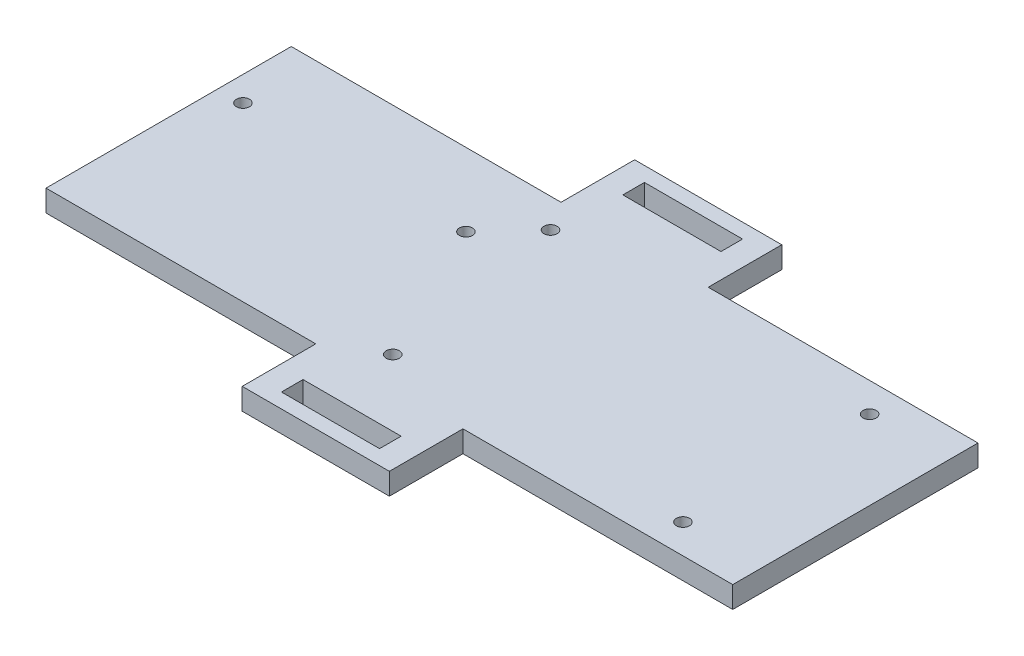
ISO-10303-21;
HEADER;
FILE_DESCRIPTION(('STEP AP214'),'2;1');
FILE_NAME('part.step','',(''),(''),'','','');
FILE_SCHEMA(('AUTOMOTIVE_DESIGN { 1 0 10303 214 1 1 1 1 }'));
ENDSEC;
DATA;
#1=APPLICATION_CONTEXT('core data for automotive mechanical design processes');
#2=APPLICATION_PROTOCOL_DEFINITION('international standard','automotive_design',2000,#1);
#3=PRODUCT_CONTEXT('',#1,'mechanical');
#4=PRODUCT('Part','Part','',(#3));
#5=PRODUCT_RELATED_PRODUCT_CATEGORY('part','',(#4));
#6=PRODUCT_DEFINITION_FORMATION('','',#4);
#7=PRODUCT_DEFINITION_CONTEXT('part definition',#1,'design');
#8=PRODUCT_DEFINITION('design','',#6,#7);
#9=PRODUCT_DEFINITION_SHAPE('','',#8);
#10=(LENGTH_UNIT() NAMED_UNIT(*) SI_UNIT(.MILLI.,.METRE.));
#11=(NAMED_UNIT(*) PLANE_ANGLE_UNIT() SI_UNIT($,.RADIAN.));
#12=(NAMED_UNIT(*) SI_UNIT($,.STERADIAN.) SOLID_ANGLE_UNIT());
#13=UNCERTAINTY_MEASURE_WITH_UNIT(LENGTH_MEASURE(1.E-05),#10,'distance_accuracy_value','');
#14=(GEOMETRIC_REPRESENTATION_CONTEXT(3) GLOBAL_UNCERTAINTY_ASSIGNED_CONTEXT((#13)) GLOBAL_UNIT_ASSIGNED_CONTEXT((#10,
#11,#12)) REPRESENTATION_CONTEXT('',''));
#15=CARTESIAN_POINT('',(0.,0.,0.));
#16=DIRECTION('',(0.,0.,1.));
#17=DIRECTION('',(1.,0.,0.));
#18=AXIS2_PLACEMENT_3D('',#15,#16,#17);
#19=CARTESIAN_POINT('',(19.05,5.588,-31.75));
#20=DIRECTION('',(0.,0.,1.));
#21=DIRECTION('',(1.,0.,0.));
#22=AXIS2_PLACEMENT_3D('',#19,#20,#21);
#23=PLANE('',#22);
#24=DIRECTION('',(-1.,0.,0.));
#25=VECTOR('',#24,1.);
#26=CARTESIAN_POINT('',(19.05,0.,-31.75));
#27=LINE('',#26,#25);
#28=CARTESIAN_POINT('',(88.9,0.,-31.75));
#29=VERTEX_POINT('',#28);
#30=CARTESIAN_POINT('',(19.05,0.,-31.75));
#31=VERTEX_POINT('',#30);
#32=EDGE_CURVE('E210',#29,#31,#27,.T.);
#33=ORIENTED_EDGE('',*,*,#32,.T.);
#34=DIRECTION('',(0.,-1.,0.));
#35=VECTOR('',#34,1.);
#36=CARTESIAN_POINT('',(19.05,5.588,-31.75));
#37=LINE('',#36,#35);
#38=CARTESIAN_POINT('',(19.05,5.588,-31.75));
#39=VERTEX_POINT('',#38);
#40=EDGE_CURVE('E11',#39,#31,#37,.T.);
#41=ORIENTED_EDGE('',*,*,#40,.F.);
#42=DIRECTION('',(-1.,0.,0.));
#43=VECTOR('',#42,1.);
#44=CARTESIAN_POINT('',(19.05,5.588,-31.75));
#45=LINE('',#44,#43);
#46=CARTESIAN_POINT('',(88.9,5.588,-31.75));
#47=VERTEX_POINT('',#46);
#48=EDGE_CURVE('E243',#47,#39,#45,.T.);
#49=ORIENTED_EDGE('',*,*,#48,.F.);
#50=DIRECTION('',(0.,-1.,0.));
#51=VECTOR('',#50,1.);
#52=CARTESIAN_POINT('',(88.9,5.588,-31.75));
#53=LINE('',#52,#51);
#54=EDGE_CURVE('E269',#47,#29,#53,.T.);
#55=ORIENTED_EDGE('',*,*,#54,.T.);
#56=EDGE_LOOP('',(#33,#41,#49,#55));
#57=FACE_BOUND('',#56,.T.);
#58=ADVANCED_FACE('F34',(#57),#23,.F.);
#59=CARTESIAN_POINT('',(19.05,5.588,-31.75));
#60=DIRECTION('',(-1.,0.,0.));
#61=DIRECTION('',(0.,0.,1.));
#62=AXIS2_PLACEMENT_3D('',#59,#60,#61);
#63=PLANE('',#62);
#64=DIRECTION('',(0.,0.,-1.));
#65=VECTOR('',#64,1.);
#66=CARTESIAN_POINT('',(19.05,0.,-31.75));
#67=LINE('',#66,#65);
#68=CARTESIAN_POINT('',(19.05,0.,-50.8));
#69=VERTEX_POINT('',#68);
#70=EDGE_CURVE('E272',#31,#69,#67,.T.);
#71=ORIENTED_EDGE('',*,*,#70,.T.);
#72=DIRECTION('',(0.,-1.,0.));
#73=VECTOR('',#72,1.);
#74=CARTESIAN_POINT('',(19.05,5.588,-50.8));
#75=LINE('',#74,#73);
#76=CARTESIAN_POINT('',(19.05,5.588,-50.8));
#77=VERTEX_POINT('',#76);
#78=EDGE_CURVE('E41',#77,#69,#75,.T.);
#79=ORIENTED_EDGE('',*,*,#78,.F.);
#80=DIRECTION('',(0.,0.,-1.));
#81=VECTOR('',#80,1.);
#82=CARTESIAN_POINT('',(19.05,5.588,-31.75));
#83=LINE('',#82,#81);
#84=EDGE_CURVE('E246',#39,#77,#83,.T.);
#85=ORIENTED_EDGE('',*,*,#84,.F.);
#86=ORIENTED_EDGE('',*,*,#40,.T.);
#87=EDGE_LOOP('',(#71,#79,#85,#86));
#88=FACE_BOUND('',#87,.T.);
#89=ADVANCED_FACE('F348',(#88),#63,.F.);
#90=CARTESIAN_POINT('',(19.05,5.588,-50.8));
#91=DIRECTION('',(0.,0.,1.));
#92=DIRECTION('',(1.,0.,0.));
#93=AXIS2_PLACEMENT_3D('',#90,#91,#92);
#94=PLANE('',#93);
#95=DIRECTION('',(-1.,0.,0.));
#96=VECTOR('',#95,1.);
#97=CARTESIAN_POINT('',(19.05,0.,-50.8));
#98=LINE('',#97,#96);
#99=CARTESIAN_POINT('',(-19.05,0.,-50.8));
#100=VERTEX_POINT('',#99);
#101=EDGE_CURVE('E274',#69,#100,#98,.T.);
#102=ORIENTED_EDGE('',*,*,#101,.T.);
#103=DIRECTION('',(0.,-1.,0.));
#104=VECTOR('',#103,1.);
#105=CARTESIAN_POINT('',(-19.05,5.588,-50.8));
#106=LINE('',#105,#104);
#107=CARTESIAN_POINT('',(-19.05,5.588,-50.8));
#108=VERTEX_POINT('',#107);
#109=EDGE_CURVE('E319',#108,#100,#106,.T.);
#110=ORIENTED_EDGE('',*,*,#109,.F.);
#111=DIRECTION('',(-1.,0.,0.));
#112=VECTOR('',#111,1.);
#113=CARTESIAN_POINT('',(19.05,5.588,-50.8));
#114=LINE('',#113,#112);
#115=EDGE_CURVE('E249',#77,#108,#114,.T.);
#116=ORIENTED_EDGE('',*,*,#115,.F.);
#117=ORIENTED_EDGE('',*,*,#78,.T.);
#118=EDGE_LOOP('',(#102,#110,#116,#117));
#119=FACE_BOUND('',#118,.T.);
#120=ADVANCED_FACE('F326',(#119),#94,.F.);
#121=CARTESIAN_POINT('',(-19.05,5.588,-50.8));
#122=DIRECTION('',(1.,0.,0.));
#123=DIRECTION('',(0.,0.,-1.));
#124=AXIS2_PLACEMENT_3D('',#121,#122,#123);
#125=PLANE('',#124);
#126=DIRECTION('',(0.,0.,1.));
#127=VECTOR('',#126,1.);
#128=CARTESIAN_POINT('',(-19.05,0.,-50.8));
#129=LINE('',#128,#127);
#130=CARTESIAN_POINT('',(-19.05,0.,-31.75));
#131=VERTEX_POINT('',#130);
#132=EDGE_CURVE('E276',#100,#131,#129,.T.);
#133=ORIENTED_EDGE('',*,*,#132,.T.);
#134=DIRECTION('',(0.,-1.,0.));
#135=VECTOR('',#134,1.);
#136=CARTESIAN_POINT('',(-19.05,5.588,-31.75));
#137=LINE('',#136,#135);
#138=CARTESIAN_POINT('',(-19.05,5.588,-31.75));
#139=VERTEX_POINT('',#138);
#140=EDGE_CURVE('E316',#139,#131,#137,.T.);
#141=ORIENTED_EDGE('',*,*,#140,.F.);
#142=DIRECTION('',(0.,0.,1.));
#143=VECTOR('',#142,1.);
#144=CARTESIAN_POINT('',(-19.05,5.588,-50.8));
#145=LINE('',#144,#143);
#146=EDGE_CURVE('E251',#108,#139,#145,.T.);
#147=ORIENTED_EDGE('',*,*,#146,.F.);
#148=ORIENTED_EDGE('',*,*,#109,.T.);
#149=EDGE_LOOP('',(#133,#141,#147,#148));
#150=FACE_BOUND('',#149,.T.);
#151=ADVANCED_FACE('F336',(#150),#125,.F.);
#152=CARTESIAN_POINT('',(-88.9,5.588,-31.75));
#153=DIRECTION('',(0.,0.,1.));
#154=DIRECTION('',(1.,0.,0.));
#155=AXIS2_PLACEMENT_3D('',#152,#153,#154);
#156=PLANE('',#155);
#157=DIRECTION('',(-1.,0.,0.));
#158=VECTOR('',#157,1.);
#159=CARTESIAN_POINT('',(-88.9,0.,-31.75));
#160=LINE('',#159,#158);
#161=CARTESIAN_POINT('',(-88.9,0.,-31.75));
#162=VERTEX_POINT('',#161);
#163=EDGE_CURVE('E278',#131,#162,#160,.T.);
#164=ORIENTED_EDGE('',*,*,#163,.T.);
#165=DIRECTION('',(0.,-1.,0.));
#166=VECTOR('',#165,1.);
#167=CARTESIAN_POINT('',(-88.9,5.588,-31.75));
#168=LINE('',#167,#166);
#169=CARTESIAN_POINT('',(-88.9,5.588,-31.75));
#170=VERTEX_POINT('',#169);
#171=EDGE_CURVE('E313',#170,#162,#168,.T.);
#172=ORIENTED_EDGE('',*,*,#171,.F.);
#173=DIRECTION('',(-1.,0.,0.));
#174=VECTOR('',#173,1.);
#175=CARTESIAN_POINT('',(-88.9,5.588,-31.75));
#176=LINE('',#175,#174);
#177=EDGE_CURVE('E253',#139,#170,#176,.T.);
#178=ORIENTED_EDGE('',*,*,#177,.F.);
#179=ORIENTED_EDGE('',*,*,#140,.T.);
#180=EDGE_LOOP('',(#164,#172,#178,#179));
#181=FACE_BOUND('',#180,.T.);
#182=ADVANCED_FACE('F340',(#181),#156,.F.);
#183=CARTESIAN_POINT('',(-88.9,5.588,31.75));
#184=DIRECTION('',(1.,0.,0.));
#185=DIRECTION('',(0.,0.,-1.));
#186=AXIS2_PLACEMENT_3D('',#183,#184,#185);
#187=PLANE('',#186);
#188=DIRECTION('',(0.,0.,1.));
#189=VECTOR('',#188,1.);
#190=CARTESIAN_POINT('',(-88.9,0.,31.75));
#191=LINE('',#190,#189);
#192=CARTESIAN_POINT('',(-88.9,0.,31.75));
#193=VERTEX_POINT('',#192);
#194=EDGE_CURVE('E280',#162,#193,#191,.T.);
#195=ORIENTED_EDGE('',*,*,#194,.T.);
#196=DIRECTION('',(0.,-1.,0.));
#197=VECTOR('',#196,1.);
#198=CARTESIAN_POINT('',(-88.9,5.588,31.75));
#199=LINE('',#198,#197);
#200=CARTESIAN_POINT('',(-88.9,5.588,31.75));
#201=VERTEX_POINT('',#200);
#202=EDGE_CURVE('E310',#201,#193,#199,.T.);
#203=ORIENTED_EDGE('',*,*,#202,.F.);
#204=DIRECTION('',(0.,0.,1.));
#205=VECTOR('',#204,1.);
#206=CARTESIAN_POINT('',(-88.9,5.588,31.75));
#207=LINE('',#206,#205);
#208=EDGE_CURVE('E255',#170,#201,#207,.T.);
#209=ORIENTED_EDGE('',*,*,#208,.F.);
#210=ORIENTED_EDGE('',*,*,#171,.T.);
#211=EDGE_LOOP('',(#195,#203,#209,#210));
#212=FACE_BOUND('',#211,.T.);
#213=ADVANCED_FACE('F381',(#212),#187,.F.);
#214=CARTESIAN_POINT('',(-88.9,5.588,31.75));
#215=DIRECTION('',(0.,0.,-1.));
#216=DIRECTION('',(-1.,0.,0.));
#217=AXIS2_PLACEMENT_3D('',#214,#215,#216);
#218=PLANE('',#217);
#219=DIRECTION('',(1.,0.,0.));
#220=VECTOR('',#219,1.);
#221=CARTESIAN_POINT('',(-88.9,0.,31.75));
#222=LINE('',#221,#220);
#223=CARTESIAN_POINT('',(-19.05,0.,31.75));
#224=VERTEX_POINT('',#223);
#225=EDGE_CURVE('E282',#193,#224,#222,.T.);
#226=ORIENTED_EDGE('',*,*,#225,.T.);
#227=DIRECTION('',(0.,-1.,0.));
#228=VECTOR('',#227,1.);
#229=CARTESIAN_POINT('',(-19.05,5.588,31.75));
#230=LINE('',#229,#228);
#231=CARTESIAN_POINT('',(-19.05,5.588,31.75));
#232=VERTEX_POINT('',#231);
#233=EDGE_CURVE('E307',#232,#224,#230,.T.);
#234=ORIENTED_EDGE('',*,*,#233,.F.);
#235=DIRECTION('',(1.,0.,0.));
#236=VECTOR('',#235,1.);
#237=CARTESIAN_POINT('',(-88.9,5.588,31.75));
#238=LINE('',#237,#236);
#239=EDGE_CURVE('E257',#201,#232,#238,.T.);
#240=ORIENTED_EDGE('',*,*,#239,.F.);
#241=ORIENTED_EDGE('',*,*,#202,.T.);
#242=EDGE_LOOP('',(#226,#234,#240,#241));
#243=FACE_BOUND('',#242,.T.);
#244=ADVANCED_FACE('F379',(#243),#218,.F.);
#245=CARTESIAN_POINT('',(-19.05,5.588,50.8));
#246=DIRECTION('',(1.,0.,0.));
#247=DIRECTION('',(0.,0.,-1.));
#248=AXIS2_PLACEMENT_3D('',#245,#246,#247);
#249=PLANE('',#248);
#250=DIRECTION('',(0.,0.,1.));
#251=VECTOR('',#250,1.);
#252=CARTESIAN_POINT('',(-19.05,0.,50.8));
#253=LINE('',#252,#251);
#254=CARTESIAN_POINT('',(-19.05,0.,50.8));
#255=VERTEX_POINT('',#254);
#256=EDGE_CURVE('E284',#224,#255,#253,.T.);
#257=ORIENTED_EDGE('',*,*,#256,.T.);
#258=DIRECTION('',(0.,-1.,0.));
#259=VECTOR('',#258,1.);
#260=CARTESIAN_POINT('',(-19.05,5.588,50.8));
#261=LINE('',#260,#259);
#262=CARTESIAN_POINT('',(-19.05,5.588,50.8));
#263=VERTEX_POINT('',#262);
#264=EDGE_CURVE('E304',#263,#255,#261,.T.);
#265=ORIENTED_EDGE('',*,*,#264,.F.);
#266=DIRECTION('',(0.,0.,1.));
#267=VECTOR('',#266,1.);
#268=CARTESIAN_POINT('',(-19.05,5.588,50.8));
#269=LINE('',#268,#267);
#270=EDGE_CURVE('E259',#232,#263,#269,.T.);
#271=ORIENTED_EDGE('',*,*,#270,.F.);
#272=ORIENTED_EDGE('',*,*,#233,.T.);
#273=EDGE_LOOP('',(#257,#265,#271,#272));
#274=FACE_BOUND('',#273,.T.);
#275=ADVANCED_FACE('F375',(#274),#249,.F.);
#276=CARTESIAN_POINT('',(19.05,5.588,50.8));
#277=DIRECTION('',(0.,0.,-1.));
#278=DIRECTION('',(-1.,0.,0.));
#279=AXIS2_PLACEMENT_3D('',#276,#277,#278);
#280=PLANE('',#279);
#281=DIRECTION('',(1.,0.,0.));
#282=VECTOR('',#281,1.);
#283=CARTESIAN_POINT('',(19.05,0.,50.8));
#284=LINE('',#283,#282);
#285=CARTESIAN_POINT('',(19.05,0.,50.8));
#286=VERTEX_POINT('',#285);
#287=EDGE_CURVE('E286',#255,#286,#284,.T.);
#288=ORIENTED_EDGE('',*,*,#287,.T.);
#289=DIRECTION('',(0.,-1.,0.));
#290=VECTOR('',#289,1.);
#291=CARTESIAN_POINT('',(19.05,5.588,50.8));
#292=LINE('',#291,#290);
#293=CARTESIAN_POINT('',(19.05,5.588,50.8));
#294=VERTEX_POINT('',#293);
#295=EDGE_CURVE('E301',#294,#286,#292,.T.);
#296=ORIENTED_EDGE('',*,*,#295,.F.);
#297=DIRECTION('',(1.,0.,0.));
#298=VECTOR('',#297,1.);
#299=CARTESIAN_POINT('',(19.05,5.588,50.8));
#300=LINE('',#299,#298);
#301=EDGE_CURVE('E261',#263,#294,#300,.T.);
#302=ORIENTED_EDGE('',*,*,#301,.F.);
#303=ORIENTED_EDGE('',*,*,#264,.T.);
#304=EDGE_LOOP('',(#288,#296,#302,#303));
#305=FACE_BOUND('',#304,.T.);
#306=ADVANCED_FACE('F370',(#305),#280,.F.);
#307=CARTESIAN_POINT('',(19.05,5.588,31.75));
#308=DIRECTION('',(-1.,0.,0.));
#309=DIRECTION('',(0.,0.,1.));
#310=AXIS2_PLACEMENT_3D('',#307,#308,#309);
#311=PLANE('',#310);
#312=DIRECTION('',(0.,0.,-1.));
#313=VECTOR('',#312,1.);
#314=CARTESIAN_POINT('',(19.05,0.,31.75));
#315=LINE('',#314,#313);
#316=CARTESIAN_POINT('',(19.05,0.,31.75));
#317=VERTEX_POINT('',#316);
#318=EDGE_CURVE('E288',#286,#317,#315,.T.);
#319=ORIENTED_EDGE('',*,*,#318,.T.);
#320=DIRECTION('',(0.,-1.,0.));
#321=VECTOR('',#320,1.);
#322=CARTESIAN_POINT('',(19.05,5.588,31.75));
#323=LINE('',#322,#321);
#324=CARTESIAN_POINT('',(19.05,5.588,31.75));
#325=VERTEX_POINT('',#324);
#326=EDGE_CURVE('E298',#325,#317,#323,.T.);
#327=ORIENTED_EDGE('',*,*,#326,.F.);
#328=DIRECTION('',(0.,0.,-1.));
#329=VECTOR('',#328,1.);
#330=CARTESIAN_POINT('',(19.05,5.588,31.75));
#331=LINE('',#330,#329);
#332=EDGE_CURVE('E263',#294,#325,#331,.T.);
#333=ORIENTED_EDGE('',*,*,#332,.F.);
#334=ORIENTED_EDGE('',*,*,#295,.T.);
#335=EDGE_LOOP('',(#319,#327,#333,#334));
#336=FACE_BOUND('',#335,.T.);
#337=ADVANCED_FACE('F364',(#336),#311,.F.);
#338=CARTESIAN_POINT('',(19.05,5.588,31.75));
#339=DIRECTION('',(0.,0.,-1.));
#340=DIRECTION('',(-1.,0.,0.));
#341=AXIS2_PLACEMENT_3D('',#338,#339,#340);
#342=PLANE('',#341);
#343=DIRECTION('',(1.,0.,0.));
#344=VECTOR('',#343,1.);
#345=CARTESIAN_POINT('',(19.05,0.,31.75));
#346=LINE('',#345,#344);
#347=CARTESIAN_POINT('',(88.9,0.,31.75));
#348=VERTEX_POINT('',#347);
#349=EDGE_CURVE('E290',#317,#348,#346,.T.);
#350=ORIENTED_EDGE('',*,*,#349,.T.);
#351=DIRECTION('',(0.,-1.,0.));
#352=VECTOR('',#351,1.);
#353=CARTESIAN_POINT('',(88.9,5.588,31.75));
#354=LINE('',#353,#352);
#355=CARTESIAN_POINT('',(88.9,5.588,31.75));
#356=VERTEX_POINT('',#355);
#357=EDGE_CURVE('E295',#356,#348,#354,.T.);
#358=ORIENTED_EDGE('',*,*,#357,.F.);
#359=DIRECTION('',(1.,0.,0.));
#360=VECTOR('',#359,1.);
#361=CARTESIAN_POINT('',(19.05,5.588,31.75));
#362=LINE('',#361,#360);
#363=EDGE_CURVE('E265',#325,#356,#362,.T.);
#364=ORIENTED_EDGE('',*,*,#363,.F.);
#365=ORIENTED_EDGE('',*,*,#326,.T.);
#366=EDGE_LOOP('',(#350,#358,#364,#365));
#367=FACE_BOUND('',#366,.T.);
#368=ADVANCED_FACE('F360',(#367),#342,.F.);
#369=CARTESIAN_POINT('',(88.9,5.588,31.75));
#370=DIRECTION('',(-1.,0.,0.));
#371=DIRECTION('',(0.,0.,1.));
#372=AXIS2_PLACEMENT_3D('',#369,#370,#371);
#373=PLANE('',#372);
#374=DIRECTION('',(0.,0.,-1.));
#375=VECTOR('',#374,1.);
#376=CARTESIAN_POINT('',(88.9,0.,31.75));
#377=LINE('',#376,#375);
#378=EDGE_CURVE('E247',#348,#29,#377,.T.);
#379=ORIENTED_EDGE('',*,*,#378,.T.);
#380=ORIENTED_EDGE('',*,*,#54,.F.);
#381=DIRECTION('',(0.,0.,-1.));
#382=VECTOR('',#381,1.);
#383=CARTESIAN_POINT('',(88.9,5.588,31.75));
#384=LINE('',#383,#382);
#385=EDGE_CURVE('E267',#356,#47,#384,.T.);
#386=ORIENTED_EDGE('',*,*,#385,.F.);
#387=ORIENTED_EDGE('',*,*,#357,.T.);
#388=EDGE_LOOP('',(#379,#380,#386,#387));
#389=FACE_BOUND('',#388,.T.);
#390=ADVANCED_FACE('F355',(#389),#373,.F.);
#391=CARTESIAN_POINT('',(0.,5.588,0.));
#392=DIRECTION('',(0.,1.,0.));
#393=DIRECTION('',(0.,0.,1.));
#394=AXIS2_PLACEMENT_3D('',#391,#392,#393);
#395=PLANE('',#394);
#396=CARTESIAN_POINT('',(-24.765,5.588,-12.827));
#397=DIRECTION('',(0.,1.,0.));
#398=DIRECTION('',(0.,0.,1.));
#399=AXIS2_PLACEMENT_3D('',#396,#397,#398);
#400=CIRCLE('',#399,1.69999999999999);
#401=CARTESIAN_POINT('',(-24.765,5.588,-11.127));
#402=VERTEX_POINT('',#401);
#403=EDGE_CURVE('E621',#402,#402,#400,.T.);
#404=ORIENTED_EDGE('',*,*,#403,.F.);
#405=EDGE_LOOP('',(#404));
#406=FACE_BOUND('',#405,.T.);
#407=CARTESIAN_POINT('',(-82.4865,5.588,-12.827));
#408=DIRECTION('',(0.,1.,0.));
#409=DIRECTION('',(0.,0.,1.));
#410=AXIS2_PLACEMENT_3D('',#407,#408,#409);
#411=CIRCLE('',#410,1.69999999999999);
#412=CARTESIAN_POINT('',(-82.4865,5.588,-11.127));
#413=VERTEX_POINT('',#412);
#414=EDGE_CURVE('E623',#413,#413,#411,.T.);
#415=ORIENTED_EDGE('',*,*,#414,.F.);
#416=EDGE_LOOP('',(#415));
#417=FACE_BOUND('',#416,.T.);
#418=CARTESIAN_POINT('',(-14.1986,5.588,-24.1681));
#419=DIRECTION('',(0.,1.,0.));
#420=DIRECTION('',(0.,0.,1.));
#421=AXIS2_PLACEMENT_3D('',#418,#419,#420);
#422=CIRCLE('',#421,1.7);
#423=CARTESIAN_POINT('',(-14.1986,5.588,-22.4681));
#424=VERTEX_POINT('',#423);
#425=EDGE_CURVE('E631',#424,#424,#422,.T.);
#426=ORIENTED_EDGE('',*,*,#425,.F.);
#427=EDGE_LOOP('',(#426));
#428=FACE_BOUND('',#427,.T.);
#429=CARTESIAN_POINT('',(68.4276,5.588,-24.1681));
#430=DIRECTION('',(0.,1.,0.));
#431=DIRECTION('',(0.,0.,1.));
#432=AXIS2_PLACEMENT_3D('',#429,#430,#431);
#433=CIRCLE('',#432,1.69999999999999);
#434=CARTESIAN_POINT('',(68.4276,5.588,-22.4681));
#435=VERTEX_POINT('',#434);
#436=EDGE_CURVE('E637',#435,#435,#433,.T.);
#437=ORIENTED_EDGE('',*,*,#436,.F.);
#438=EDGE_LOOP('',(#437));
#439=FACE_BOUND('',#438,.T.);
#440=CARTESIAN_POINT('',(68.4276,5.588,24.1681));
#441=DIRECTION('',(0.,1.,0.));
#442=DIRECTION('',(0.,0.,1.));
#443=AXIS2_PLACEMENT_3D('',#440,#441,#442);
#444=CIRCLE('',#443,1.69999999999999);
#445=CARTESIAN_POINT('',(68.4276,5.588,25.8681));
#446=VERTEX_POINT('',#445);
#447=EDGE_CURVE('E643',#446,#446,#444,.T.);
#448=ORIENTED_EDGE('',*,*,#447,.F.);
#449=EDGE_LOOP('',(#448));
#450=FACE_BOUND('',#449,.T.);
#451=CARTESIAN_POINT('',(-6.70559999999999,5.588,24.1681));
#452=DIRECTION('',(0.,1.,0.));
#453=DIRECTION('',(0.,0.,1.));
#454=AXIS2_PLACEMENT_3D('',#451,#452,#453);
#455=CIRCLE('',#454,1.7);
#456=CARTESIAN_POINT('',(-6.70559999999999,5.588,25.8681));
#457=VERTEX_POINT('',#456);
#458=EDGE_CURVE('E648',#457,#457,#455,.T.);
#459=ORIENTED_EDGE('',*,*,#458,.F.);
#460=EDGE_LOOP('',(#459));
#461=FACE_BOUND('',#460,.T.);
#462=DIRECTION('',(0.,0.,-1.));
#463=VECTOR('',#462,1.);
#464=CARTESIAN_POINT('',(12.7,5.588,-41.402));
#465=LINE('',#464,#463);
#466=CARTESIAN_POINT('',(12.7,5.588,-41.402));
#467=VERTEX_POINT('',#466);
#468=CARTESIAN_POINT('',(12.7,5.588,-46.99));
#469=VERTEX_POINT('',#468);
#470=EDGE_CURVE('E48',#467,#469,#465,.T.);
#471=ORIENTED_EDGE('',*,*,#470,.F.);
#472=DIRECTION('',(1.,0.,0.));
#473=VECTOR('',#472,1.);
#474=CARTESIAN_POINT('',(-12.7,5.588,-41.402));
#475=LINE('',#474,#473);
#476=CARTESIAN_POINT('',(-12.7,5.588,-41.402));
#477=VERTEX_POINT('',#476);
#478=EDGE_CURVE('E191',#477,#467,#475,.T.);
#479=ORIENTED_EDGE('',*,*,#478,.F.);
#480=DIRECTION('',(0.,0.,1.));
#481=VECTOR('',#480,1.);
#482=CARTESIAN_POINT('',(-12.7,5.588,-41.402));
#483=LINE('',#482,#481);
#484=CARTESIAN_POINT('',(-12.7,5.588,-46.99));
#485=VERTEX_POINT('',#484);
#486=EDGE_CURVE('E194',#485,#477,#483,.T.);
#487=ORIENTED_EDGE('',*,*,#486,.F.);
#488=DIRECTION('',(-1.,0.,0.));
#489=VECTOR('',#488,1.);
#490=CARTESIAN_POINT('',(-12.7,5.588,-46.99));
#491=LINE('',#490,#489);
#492=EDGE_CURVE('E203',#469,#485,#491,.T.);
#493=ORIENTED_EDGE('',*,*,#492,.F.);
#494=EDGE_LOOP('',(#471,#479,#487,#493));
#495=FACE_BOUND('',#494,.T.);
#496=DIRECTION('',(0.,0.,1.));
#497=VECTOR('',#496,1.);
#498=CARTESIAN_POINT('',(-12.7,5.588,41.402));
#499=LINE('',#498,#497);
#500=CARTESIAN_POINT('',(-12.7,5.588,41.402));
#501=VERTEX_POINT('',#500);
#502=CARTESIAN_POINT('',(-12.7,5.588,46.99));
#503=VERTEX_POINT('',#502);
#504=EDGE_CURVE('E56',#501,#503,#499,.T.);
#505=ORIENTED_EDGE('',*,*,#504,.F.);
#506=DIRECTION('',(-1.,0.,0.));
#507=VECTOR('',#506,1.);
#508=CARTESIAN_POINT('',(-12.7,5.588,41.402));
#509=LINE('',#508,#507);
#510=CARTESIAN_POINT('',(12.7,5.588,41.402));
#511=VERTEX_POINT('',#510);
#512=EDGE_CURVE('E218',#511,#501,#509,.T.);
#513=ORIENTED_EDGE('',*,*,#512,.F.);
#514=DIRECTION('',(0.,0.,-1.));
#515=VECTOR('',#514,1.);
#516=CARTESIAN_POINT('',(12.7,5.588,41.402));
#517=LINE('',#516,#515);
#518=CARTESIAN_POINT('',(12.7,5.588,46.99));
#519=VERTEX_POINT('',#518);
#520=EDGE_CURVE('E232',#519,#511,#517,.T.);
#521=ORIENTED_EDGE('',*,*,#520,.F.);
#522=DIRECTION('',(1.,0.,0.));
#523=VECTOR('',#522,1.);
#524=CARTESIAN_POINT('',(-12.7,5.588,46.99));
#525=LINE('',#524,#523);
#526=EDGE_CURVE('E229',#503,#519,#525,.T.);
#527=ORIENTED_EDGE('',*,*,#526,.F.);
#528=EDGE_LOOP('',(#505,#513,#521,#527));
#529=FACE_BOUND('',#528,.T.);
#530=ORIENTED_EDGE('',*,*,#48,.T.);
#531=ORIENTED_EDGE('',*,*,#84,.T.);
#532=ORIENTED_EDGE('',*,*,#115,.T.);
#533=ORIENTED_EDGE('',*,*,#146,.T.);
#534=ORIENTED_EDGE('',*,*,#177,.T.);
#535=ORIENTED_EDGE('',*,*,#208,.T.);
#536=ORIENTED_EDGE('',*,*,#239,.T.);
#537=ORIENTED_EDGE('',*,*,#270,.T.);
#538=ORIENTED_EDGE('',*,*,#301,.T.);
#539=ORIENTED_EDGE('',*,*,#332,.T.);
#540=ORIENTED_EDGE('',*,*,#363,.T.);
#541=ORIENTED_EDGE('',*,*,#385,.T.);
#542=EDGE_LOOP('',(#530,#531,#532,#533,#534,#535,#536,#537,#538,#539,#540,#541));
#543=FACE_BOUND('',#542,.T.);
#544=ADVANCED_FACE('F344',(#406,#417,#428,#439,#450,#461,#495,#529,#543),#395,.T.);
#545=CARTESIAN_POINT('',(0.,0.,0.));
#546=DIRECTION('',(0.,1.,0.));
#547=DIRECTION('',(0.,0.,1.));
#548=AXIS2_PLACEMENT_3D('',#545,#546,#547);
#549=PLANE('',#548);
#550=CARTESIAN_POINT('',(-24.765,0.,-12.827));
#551=DIRECTION('',(0.,1.,0.));
#552=DIRECTION('',(0.,0.,1.));
#553=AXIS2_PLACEMENT_3D('',#550,#551,#552);
#554=CIRCLE('',#553,1.7);
#555=CARTESIAN_POINT('',(-24.765,0.,-11.127));
#556=VERTEX_POINT('',#555);
#557=EDGE_CURVE('E618',#556,#556,#554,.T.);
#558=ORIENTED_EDGE('',*,*,#557,.T.);
#559=EDGE_LOOP('',(#558));
#560=FACE_BOUND('',#559,.T.);
#561=CARTESIAN_POINT('',(-82.4865,0.,-12.827));
#562=DIRECTION('',(0.,1.,0.));
#563=DIRECTION('',(0.,0.,1.));
#564=AXIS2_PLACEMENT_3D('',#561,#562,#563);
#565=CIRCLE('',#564,1.69999999999999);
#566=CARTESIAN_POINT('',(-82.4865,0.,-11.127));
#567=VERTEX_POINT('',#566);
#568=EDGE_CURVE('E628',#567,#567,#565,.T.);
#569=ORIENTED_EDGE('',*,*,#568,.T.);
#570=EDGE_LOOP('',(#569));
#571=FACE_BOUND('',#570,.T.);
#572=CARTESIAN_POINT('',(-14.1986,0.,-24.1681));
#573=DIRECTION('',(0.,1.,0.));
#574=DIRECTION('',(0.,0.,1.));
#575=AXIS2_PLACEMENT_3D('',#572,#573,#574);
#576=CIRCLE('',#575,1.7);
#577=CARTESIAN_POINT('',(-14.1986,0.,-22.4681));
#578=VERTEX_POINT('',#577);
#579=EDGE_CURVE('E634',#578,#578,#576,.T.);
#580=ORIENTED_EDGE('',*,*,#579,.T.);
#581=EDGE_LOOP('',(#580));
#582=FACE_BOUND('',#581,.T.);
#583=CARTESIAN_POINT('',(68.4276,0.,-24.1681));
#584=DIRECTION('',(0.,1.,0.));
#585=DIRECTION('',(0.,0.,1.));
#586=AXIS2_PLACEMENT_3D('',#583,#584,#585);
#587=CIRCLE('',#586,1.69999999999999);
#588=CARTESIAN_POINT('',(68.4276,0.,-22.4681));
#589=VERTEX_POINT('',#588);
#590=EDGE_CURVE('E640',#589,#589,#587,.T.);
#591=ORIENTED_EDGE('',*,*,#590,.T.);
#592=EDGE_LOOP('',(#591));
#593=FACE_BOUND('',#592,.T.);
#594=CARTESIAN_POINT('',(68.4276,0.,24.1681));
#595=DIRECTION('',(0.,1.,0.));
#596=DIRECTION('',(0.,0.,1.));
#597=AXIS2_PLACEMENT_3D('',#594,#595,#596);
#598=CIRCLE('',#597,1.69999999999999);
#599=CARTESIAN_POINT('',(68.4276,0.,25.8681));
#600=VERTEX_POINT('',#599);
#601=EDGE_CURVE('E646',#600,#600,#598,.T.);
#602=ORIENTED_EDGE('',*,*,#601,.T.);
#603=EDGE_LOOP('',(#602));
#604=FACE_BOUND('',#603,.T.);
#605=CARTESIAN_POINT('',(-6.70559999999999,0.,24.1681));
#606=DIRECTION('',(0.,1.,0.));
#607=DIRECTION('',(0.,0.,1.));
#608=AXIS2_PLACEMENT_3D('',#605,#606,#607);
#609=CIRCLE('',#608,1.7);
#610=CARTESIAN_POINT('',(-6.70559999999999,0.,25.8681));
#611=VERTEX_POINT('',#610);
#612=EDGE_CURVE('E197',#611,#611,#609,.T.);
#613=ORIENTED_EDGE('',*,*,#612,.T.);
#614=EDGE_LOOP('',(#613));
#615=FACE_BOUND('',#614,.T.);
#616=DIRECTION('',(1.,0.,0.));
#617=VECTOR('',#616,1.);
#618=CARTESIAN_POINT('',(-12.7,0.,-41.402));
#619=LINE('',#618,#617);
#620=CARTESIAN_POINT('',(-12.7,0.,-41.402));
#621=VERTEX_POINT('',#620);
#622=CARTESIAN_POINT('',(12.7,0.,-41.402));
#623=VERTEX_POINT('',#622);
#624=EDGE_CURVE('E178',#621,#623,#619,.T.);
#625=ORIENTED_EDGE('',*,*,#624,.T.);
#626=DIRECTION('',(0.,0.,-1.));
#627=VECTOR('',#626,1.);
#628=CARTESIAN_POINT('',(12.7,0.,-41.402));
#629=LINE('',#628,#627);
#630=CARTESIAN_POINT('',(12.7,0.,-46.99));
#631=VERTEX_POINT('',#630);
#632=EDGE_CURVE('E172',#623,#631,#629,.T.);
#633=ORIENTED_EDGE('',*,*,#632,.T.);
#634=DIRECTION('',(-1.,0.,0.));
#635=VECTOR('',#634,1.);
#636=CARTESIAN_POINT('',(-12.7,0.,-46.99));
#637=LINE('',#636,#635);
#638=CARTESIAN_POINT('',(-12.7,0.,-46.99));
#639=VERTEX_POINT('',#638);
#640=EDGE_CURVE('E182',#631,#639,#637,.T.);
#641=ORIENTED_EDGE('',*,*,#640,.T.);
#642=DIRECTION('',(0.,0.,1.));
#643=VECTOR('',#642,1.);
#644=CARTESIAN_POINT('',(-12.7,0.,-41.402));
#645=LINE('',#644,#643);
#646=EDGE_CURVE('E186',#639,#621,#645,.T.);
#647=ORIENTED_EDGE('',*,*,#646,.T.);
#648=EDGE_LOOP('',(#625,#633,#641,#647));
#649=FACE_BOUND('',#648,.T.);
#650=DIRECTION('',(-1.,0.,0.));
#651=VECTOR('',#650,1.);
#652=CARTESIAN_POINT('',(-12.7,0.,41.402));
#653=LINE('',#652,#651);
#654=CARTESIAN_POINT('',(12.7,0.,41.402));
#655=VERTEX_POINT('',#654);
#656=CARTESIAN_POINT('',(-12.7,0.,41.402));
#657=VERTEX_POINT('',#656);
#658=EDGE_CURVE('E224',#655,#657,#653,.T.);
#659=ORIENTED_EDGE('',*,*,#658,.T.);
#660=DIRECTION('',(0.,0.,1.));
#661=VECTOR('',#660,1.);
#662=CARTESIAN_POINT('',(-12.7,0.,41.402));
#663=LINE('',#662,#661);
#664=CARTESIAN_POINT('',(-12.7,0.,46.99));
#665=VERTEX_POINT('',#664);
#666=EDGE_CURVE('E214',#657,#665,#663,.T.);
#667=ORIENTED_EDGE('',*,*,#666,.T.);
#668=DIRECTION('',(1.,0.,0.));
#669=VECTOR('',#668,1.);
#670=CARTESIAN_POINT('',(-12.7,0.,46.99));
#671=LINE('',#670,#669);
#672=CARTESIAN_POINT('',(12.7,0.,46.99));
#673=VERTEX_POINT('',#672);
#674=EDGE_CURVE('E217',#665,#673,#671,.T.);
#675=ORIENTED_EDGE('',*,*,#674,.T.);
#676=DIRECTION('',(0.,0.,-1.));
#677=VECTOR('',#676,1.);
#678=CARTESIAN_POINT('',(12.7,0.,41.402));
#679=LINE('',#678,#677);
#680=EDGE_CURVE('E221',#673,#655,#679,.T.);
#681=ORIENTED_EDGE('',*,*,#680,.T.);
#682=EDGE_LOOP('',(#659,#667,#675,#681));
#683=FACE_BOUND('',#682,.T.);
#684=ORIENTED_EDGE('',*,*,#32,.F.);
#685=ORIENTED_EDGE('',*,*,#378,.F.);
#686=ORIENTED_EDGE('',*,*,#349,.F.);
#687=ORIENTED_EDGE('',*,*,#318,.F.);
#688=ORIENTED_EDGE('',*,*,#287,.F.);
#689=ORIENTED_EDGE('',*,*,#256,.F.);
#690=ORIENTED_EDGE('',*,*,#225,.F.);
#691=ORIENTED_EDGE('',*,*,#194,.F.);
#692=ORIENTED_EDGE('',*,*,#163,.F.);
#693=ORIENTED_EDGE('',*,*,#132,.F.);
#694=ORIENTED_EDGE('',*,*,#101,.F.);
#695=ORIENTED_EDGE('',*,*,#70,.F.);
#696=EDGE_LOOP('',(#684,#685,#686,#687,#688,#689,#690,#691,#692,#693,#694,#695));
#697=FACE_BOUND('',#696,.T.);
#698=ADVANCED_FACE('F188',(#560,#571,#582,#593,#604,#615,#649,#683,#697),#549,.F.);
#699=CARTESIAN_POINT('',(-12.7,0.,41.402));
#700=DIRECTION('',(-1.,0.,0.));
#701=DIRECTION('',(0.,0.,1.));
#702=AXIS2_PLACEMENT_3D('',#699,#700,#701);
#703=PLANE('',#702);
#704=ORIENTED_EDGE('',*,*,#504,.T.);
#705=DIRECTION('',(0.,1.,0.));
#706=VECTOR('',#705,1.);
#707=CARTESIAN_POINT('',(-12.7,0.,46.99));
#708=LINE('',#707,#706);
#709=EDGE_CURVE('E227',#665,#503,#708,.T.);
#710=ORIENTED_EDGE('',*,*,#709,.F.);
#711=ORIENTED_EDGE('',*,*,#666,.F.);
#712=DIRECTION('',(0.,1.,0.));
#713=VECTOR('',#712,1.);
#714=CARTESIAN_POINT('',(-12.7,0.,41.402));
#715=LINE('',#714,#713);
#716=EDGE_CURVE('E204',#657,#501,#715,.T.);
#717=ORIENTED_EDGE('',*,*,#716,.T.);
#718=EDGE_LOOP('',(#704,#710,#711,#717));
#719=FACE_BOUND('',#718,.T.);
#720=ADVANCED_FACE('F465',(#719),#703,.F.);
#721=CARTESIAN_POINT('',(-12.7,0.,41.402));
#722=DIRECTION('',(0.,0.,-1.));
#723=DIRECTION('',(-1.,0.,0.));
#724=AXIS2_PLACEMENT_3D('',#721,#722,#723);
#725=PLANE('',#724);
#726=ORIENTED_EDGE('',*,*,#512,.T.);
#727=ORIENTED_EDGE('',*,*,#716,.F.);
#728=ORIENTED_EDGE('',*,*,#658,.F.);
#729=DIRECTION('',(0.,1.,0.));
#730=VECTOR('',#729,1.);
#731=CARTESIAN_POINT('',(12.7,0.,41.402));
#732=LINE('',#731,#730);
#733=EDGE_CURVE('E238',#655,#511,#732,.T.);
#734=ORIENTED_EDGE('',*,*,#733,.T.);
#735=EDGE_LOOP('',(#726,#727,#728,#734));
#736=FACE_BOUND('',#735,.T.);
#737=ADVANCED_FACE('F470',(#736),#725,.F.);
#738=CARTESIAN_POINT('',(12.7,0.,41.402));
#739=DIRECTION('',(1.,0.,0.));
#740=DIRECTION('',(0.,0.,-1.));
#741=AXIS2_PLACEMENT_3D('',#738,#739,#740);
#742=PLANE('',#741);
#743=ORIENTED_EDGE('',*,*,#520,.T.);
#744=ORIENTED_EDGE('',*,*,#733,.F.);
#745=ORIENTED_EDGE('',*,*,#680,.F.);
#746=DIRECTION('',(0.,1.,0.));
#747=VECTOR('',#746,1.);
#748=CARTESIAN_POINT('',(12.7,0.,46.99));
#749=LINE('',#748,#747);
#750=EDGE_CURVE('E240',#673,#519,#749,.T.);
#751=ORIENTED_EDGE('',*,*,#750,.T.);
#752=EDGE_LOOP('',(#743,#744,#745,#751));
#753=FACE_BOUND('',#752,.T.);
#754=ADVANCED_FACE('F481',(#753),#742,.F.);
#755=CARTESIAN_POINT('',(-12.7,0.,46.99));
#756=DIRECTION('',(0.,0.,1.));
#757=DIRECTION('',(1.,0.,0.));
#758=AXIS2_PLACEMENT_3D('',#755,#756,#757);
#759=PLANE('',#758);
#760=ORIENTED_EDGE('',*,*,#526,.T.);
#761=ORIENTED_EDGE('',*,*,#750,.F.);
#762=ORIENTED_EDGE('',*,*,#674,.F.);
#763=ORIENTED_EDGE('',*,*,#709,.T.);
#764=EDGE_LOOP('',(#760,#761,#762,#763));
#765=FACE_BOUND('',#764,.T.);
#766=ADVANCED_FACE('F491',(#765),#759,.F.);
#767=CARTESIAN_POINT('',(12.7,0.,-41.402));
#768=DIRECTION('',(1.,0.,0.));
#769=DIRECTION('',(0.,0.,-1.));
#770=AXIS2_PLACEMENT_3D('',#767,#768,#769);
#771=PLANE('',#770);
#772=ORIENTED_EDGE('',*,*,#470,.T.);
#773=DIRECTION('',(0.,1.,0.));
#774=VECTOR('',#773,1.);
#775=CARTESIAN_POINT('',(12.7,0.,-46.99));
#776=LINE('',#775,#774);
#777=EDGE_CURVE('E168',#631,#469,#776,.T.);
#778=ORIENTED_EDGE('',*,*,#777,.F.);
#779=ORIENTED_EDGE('',*,*,#632,.F.);
#780=DIRECTION('',(0.,1.,0.));
#781=VECTOR('',#780,1.);
#782=CARTESIAN_POINT('',(12.7,0.,-41.402));
#783=LINE('',#782,#781);
#784=EDGE_CURVE('E208',#623,#467,#783,.T.);
#785=ORIENTED_EDGE('',*,*,#784,.T.);
#786=EDGE_LOOP('',(#772,#778,#779,#785));
#787=FACE_BOUND('',#786,.T.);
#788=ADVANCED_FACE('F170',(#787),#771,.F.);
#789=CARTESIAN_POINT('',(-12.7,0.,-41.402));
#790=DIRECTION('',(0.,0.,1.));
#791=DIRECTION('',(1.,0.,0.));
#792=AXIS2_PLACEMENT_3D('',#789,#790,#791);
#793=PLANE('',#792);
#794=ORIENTED_EDGE('',*,*,#478,.T.);
#795=ORIENTED_EDGE('',*,*,#784,.F.);
#796=ORIENTED_EDGE('',*,*,#624,.F.);
#797=DIRECTION('',(0.,1.,0.));
#798=VECTOR('',#797,1.);
#799=CARTESIAN_POINT('',(-12.7,0.,-41.402));
#800=LINE('',#799,#798);
#801=EDGE_CURVE('E211',#621,#477,#800,.T.);
#802=ORIENTED_EDGE('',*,*,#801,.T.);
#803=EDGE_LOOP('',(#794,#795,#796,#802));
#804=FACE_BOUND('',#803,.T.);
#805=ADVANCED_FACE('F510',(#804),#793,.F.);
#806=CARTESIAN_POINT('',(-12.7,0.,-41.402));
#807=DIRECTION('',(-1.,0.,0.));
#808=DIRECTION('',(0.,0.,1.));
#809=AXIS2_PLACEMENT_3D('',#806,#807,#808);
#810=PLANE('',#809);
#811=ORIENTED_EDGE('',*,*,#486,.T.);
#812=ORIENTED_EDGE('',*,*,#801,.F.);
#813=ORIENTED_EDGE('',*,*,#646,.F.);
#814=DIRECTION('',(0.,1.,0.));
#815=VECTOR('',#814,1.);
#816=CARTESIAN_POINT('',(-12.7,0.,-46.99));
#817=LINE('',#816,#815);
#818=EDGE_CURVE('E177',#639,#485,#817,.T.);
#819=ORIENTED_EDGE('',*,*,#818,.T.);
#820=EDGE_LOOP('',(#811,#812,#813,#819));
#821=FACE_BOUND('',#820,.T.);
#822=ADVANCED_FACE('F519',(#821),#810,.F.);
#823=CARTESIAN_POINT('',(-12.7,0.,-46.99));
#824=DIRECTION('',(0.,0.,-1.));
#825=DIRECTION('',(-1.,0.,0.));
#826=AXIS2_PLACEMENT_3D('',#823,#824,#825);
#827=PLANE('',#826);
#828=ORIENTED_EDGE('',*,*,#492,.T.);
#829=ORIENTED_EDGE('',*,*,#818,.F.);
#830=ORIENTED_EDGE('',*,*,#640,.F.);
#831=ORIENTED_EDGE('',*,*,#777,.T.);
#832=EDGE_LOOP('',(#828,#829,#830,#831));
#833=FACE_BOUND('',#832,.T.);
#834=ADVANCED_FACE('F183',(#833),#827,.F.);
#835=CARTESIAN_POINT('',(-6.70559999999999,5.588,24.1681));
#836=DIRECTION('',(0.,1.,0.));
#837=DIRECTION('',(0.,0.,1.));
#838=AXIS2_PLACEMENT_3D('',#835,#836,#837);
#839=CYLINDRICAL_SURFACE('',#838,1.7);
#840=ORIENTED_EDGE('',*,*,#612,.F.);
#841=EDGE_LOOP('',(#840));
#842=FACE_BOUND('',#841,.T.);
#843=ORIENTED_EDGE('',*,*,#458,.T.);
#844=EDGE_LOOP('',(#843));
#845=FACE_BOUND('',#844,.T.);
#846=ADVANCED_FACE('F538',(#842,#845),#839,.F.);
#847=CARTESIAN_POINT('',(68.4276,5.588,24.1681));
#848=DIRECTION('',(0.,1.,0.));
#849=DIRECTION('',(0.,0.,1.));
#850=AXIS2_PLACEMENT_3D('',#847,#848,#849);
#851=CYLINDRICAL_SURFACE('',#850,1.69999999999999);
#852=ORIENTED_EDGE('',*,*,#601,.F.);
#853=EDGE_LOOP('',(#852));
#854=FACE_BOUND('',#853,.T.);
#855=ORIENTED_EDGE('',*,*,#447,.T.);
#856=EDGE_LOOP('',(#855));
#857=FACE_BOUND('',#856,.T.);
#858=ADVANCED_FACE('F547',(#854,#857),#851,.F.);
#859=CARTESIAN_POINT('',(68.4276,5.588,-24.1681));
#860=DIRECTION('',(0.,1.,0.));
#861=DIRECTION('',(0.,0.,1.));
#862=AXIS2_PLACEMENT_3D('',#859,#860,#861);
#863=CYLINDRICAL_SURFACE('',#862,1.69999999999999);
#864=ORIENTED_EDGE('',*,*,#590,.F.);
#865=EDGE_LOOP('',(#864));
#866=FACE_BOUND('',#865,.T.);
#867=ORIENTED_EDGE('',*,*,#436,.T.);
#868=EDGE_LOOP('',(#867));
#869=FACE_BOUND('',#868,.T.);
#870=ADVANCED_FACE('F557',(#866,#869),#863,.F.);
#871=CARTESIAN_POINT('',(-14.1986,5.588,-24.1681));
#872=DIRECTION('',(0.,1.,0.));
#873=DIRECTION('',(0.,0.,1.));
#874=AXIS2_PLACEMENT_3D('',#871,#872,#873);
#875=CYLINDRICAL_SURFACE('',#874,1.7);
#876=ORIENTED_EDGE('',*,*,#579,.F.);
#877=EDGE_LOOP('',(#876));
#878=FACE_BOUND('',#877,.T.);
#879=ORIENTED_EDGE('',*,*,#425,.T.);
#880=EDGE_LOOP('',(#879));
#881=FACE_BOUND('',#880,.T.);
#882=ADVANCED_FACE('F567',(#878,#881),#875,.F.);
#883=CARTESIAN_POINT('',(-82.4865,5.588,-12.827));
#884=DIRECTION('',(0.,1.,0.));
#885=DIRECTION('',(0.,0.,1.));
#886=AXIS2_PLACEMENT_3D('',#883,#884,#885);
#887=CYLINDRICAL_SURFACE('',#886,1.69999999999999);
#888=ORIENTED_EDGE('',*,*,#568,.F.);
#889=EDGE_LOOP('',(#888));
#890=FACE_BOUND('',#889,.T.);
#891=ORIENTED_EDGE('',*,*,#414,.T.);
#892=EDGE_LOOP('',(#891));
#893=FACE_BOUND('',#892,.T.);
#894=ADVANCED_FACE('F577',(#890,#893),#887,.F.);
#895=CARTESIAN_POINT('',(-24.765,5.588,-12.827));
#896=DIRECTION('',(0.,1.,0.));
#897=DIRECTION('',(0.,0.,1.));
#898=AXIS2_PLACEMENT_3D('',#895,#896,#897);
#899=CYLINDRICAL_SURFACE('',#898,1.69999999999999);
#900=ORIENTED_EDGE('',*,*,#557,.F.);
#901=EDGE_LOOP('',(#900));
#902=FACE_BOUND('',#901,.T.);
#903=ORIENTED_EDGE('',*,*,#403,.T.);
#904=EDGE_LOOP('',(#903));
#905=FACE_BOUND('',#904,.T.);
#906=ADVANCED_FACE('F601',(#902,#905),#899,.F.);
#907=CLOSED_SHELL('',(#58,#89,#120,#151,#182,#213,#244,#275,#306,#337,#368,#390,#544,#698,#720,
#737,#754,#766,#788,#805,#822,#834,#846,#858,#870,#882,#894,#906));
#908=MANIFOLD_SOLID_BREP('B2',#907);
#909=ADVANCED_BREP_SHAPE_REPRESENTATION('',(#18,#908),#14);
#910=SHAPE_DEFINITION_REPRESENTATION(#9,#909);
ENDSEC;
END-ISO-10303-21;
